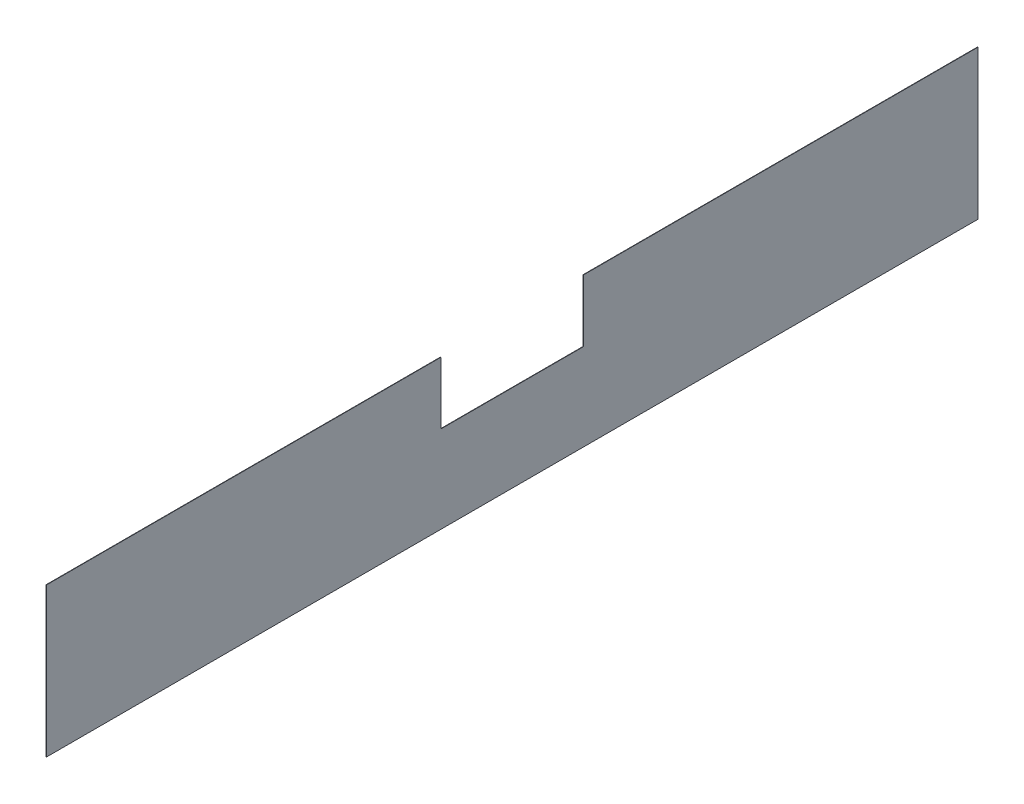
ISO-10303-21;
HEADER;
FILE_DESCRIPTION(('STEP AP214'),'2;1');
FILE_NAME('part.step','',(''),(''),'','','');
FILE_SCHEMA(('AUTOMOTIVE_DESIGN { 1 0 10303 214 1 1 1 1 }'));
ENDSEC;
DATA;
#1=APPLICATION_CONTEXT('core data for automotive mechanical design processes');
#2=APPLICATION_PROTOCOL_DEFINITION('international standard','automotive_design',2000,#1);
#3=PRODUCT_CONTEXT('',#1,'mechanical');
#4=PRODUCT('Part','Part','',(#3));
#5=PRODUCT_RELATED_PRODUCT_CATEGORY('part','',(#4));
#6=PRODUCT_DEFINITION_FORMATION('','',#4);
#7=PRODUCT_DEFINITION_CONTEXT('part definition',#1,'design');
#8=PRODUCT_DEFINITION('design','',#6,#7);
#9=PRODUCT_DEFINITION_SHAPE('','',#8);
#10=(LENGTH_UNIT() NAMED_UNIT(*) SI_UNIT(.MILLI.,.METRE.));
#11=(NAMED_UNIT(*) PLANE_ANGLE_UNIT() SI_UNIT($,.RADIAN.));
#12=(NAMED_UNIT(*) SI_UNIT($,.STERADIAN.) SOLID_ANGLE_UNIT());
#13=UNCERTAINTY_MEASURE_WITH_UNIT(LENGTH_MEASURE(1.E-05),#10,'distance_accuracy_value','');
#14=(GEOMETRIC_REPRESENTATION_CONTEXT(3) GLOBAL_UNCERTAINTY_ASSIGNED_CONTEXT((#13)) GLOBAL_UNIT_ASSIGNED_CONTEXT((#10,
#11,#12)) REPRESENTATION_CONTEXT('',''));
#15=CARTESIAN_POINT('',(0.,0.,0.));
#16=DIRECTION('',(0.,0.,1.));
#17=DIRECTION('',(1.,0.,0.));
#18=AXIS2_PLACEMENT_3D('',#15,#16,#17);
#19=CARTESIAN_POINT('',(-125.327,60.001,150.));
#20=DIRECTION('',(0.,1.,0.));
#21=DIRECTION('',(0.,0.,1.));
#22=AXIS2_PLACEMENT_3D('',#19,#20,#21);
#23=PLANE('',#22);
#24=DIRECTION('',(-1.,0.,0.));
#25=VECTOR('',#24,1.);
#26=CARTESIAN_POINT('',(-115.327,60.001,23.));
#27=LINE('',#26,#25);
#28=CARTESIAN_POINT('',(-125.2,60.001,23.));
#29=VERTEX_POINT('',#28);
#30=CARTESIAN_POINT('',(-125.327,60.001,23.));
#31=VERTEX_POINT('',#30);
#32=EDGE_CURVE('E110',#29,#31,#27,.T.);
#33=ORIENTED_EDGE('',*,*,#32,.T.);
#34=DIRECTION('',(0.,0.,1.));
#35=VECTOR('',#34,1.);
#36=CARTESIAN_POINT('',(-125.327,60.001,150.));
#37=LINE('',#36,#35);
#38=CARTESIAN_POINT('',(-125.327,60.001,150.));
#39=VERTEX_POINT('',#38);
#40=EDGE_CURVE('E122',#31,#39,#37,.T.);
#41=ORIENTED_EDGE('',*,*,#40,.T.);
#42=DIRECTION('',(1.,0.,0.));
#43=VECTOR('',#42,1.);
#44=CARTESIAN_POINT('',(-125.327,60.001,150.));
#45=LINE('',#44,#43);
#46=CARTESIAN_POINT('',(-125.2,60.001,150.));
#47=VERTEX_POINT('',#46);
#48=EDGE_CURVE('E149',#39,#47,#45,.T.);
#49=ORIENTED_EDGE('',*,*,#48,.T.);
#50=DIRECTION('',(0.,0.,1.));
#51=VECTOR('',#50,1.);
#52=CARTESIAN_POINT('',(-125.2,60.001,150.));
#53=LINE('',#52,#51);
#54=EDGE_CURVE('E124',#29,#47,#53,.T.);
#55=ORIENTED_EDGE('',*,*,#54,.F.);
#56=EDGE_LOOP('',(#33,#41,#49,#55));
#57=FACE_BOUND('',#56,.T.);
#58=ADVANCED_FACE('F43',(#57),#23,.T.);
#59=CARTESIAN_POINT('',(-125.327,-60.,150.));
#60=DIRECTION('',(0.,0.,1.));
#61=DIRECTION('',(0.,-1.,0.));
#62=AXIS2_PLACEMENT_3D('',#59,#60,#61);
#63=PLANE('',#62);
#64=DIRECTION('',(-1.,0.,0.));
#65=VECTOR('',#64,1.);
#66=CARTESIAN_POINT('',(-115.327,12.,150.));
#67=LINE('',#66,#65);
#68=CARTESIAN_POINT('',(-125.2,12.,150.));
#69=VERTEX_POINT('',#68);
#70=CARTESIAN_POINT('',(-125.327,12.,150.));
#71=VERTEX_POINT('',#70);
#72=EDGE_CURVE('E164',#69,#71,#67,.T.);
#73=ORIENTED_EDGE('',*,*,#72,.F.);
#74=DIRECTION('',(0.,-1.,0.));
#75=VECTOR('',#74,1.);
#76=CARTESIAN_POINT('',(-125.2,-60.,150.));
#77=LINE('',#76,#75);
#78=EDGE_CURVE('E141',#47,#69,#77,.T.);
#79=ORIENTED_EDGE('',*,*,#78,.F.);
#80=ORIENTED_EDGE('',*,*,#48,.F.);
#81=DIRECTION('',(0.,-1.,0.));
#82=VECTOR('',#81,1.);
#83=CARTESIAN_POINT('',(-125.327,-60.,150.));
#84=LINE('',#83,#82);
#85=EDGE_CURVE('E132',#39,#71,#84,.T.);
#86=ORIENTED_EDGE('',*,*,#85,.T.);
#87=EDGE_LOOP('',(#73,#79,#80,#86));
#88=FACE_BOUND('',#87,.T.);
#89=ADVANCED_FACE('F45',(#88),#63,.T.);
#90=DIRECTION('',(-1.,0.,0.));
#91=VECTOR('',#90,1.);
#92=CARTESIAN_POINT('',(-115.327,60.001,-23.));
#93=LINE('',#92,#91);
#94=CARTESIAN_POINT('',(-125.2,60.001,-23.));
#95=VERTEX_POINT('',#94);
#96=CARTESIAN_POINT('',(-125.327,60.001,-23.));
#97=VERTEX_POINT('',#96);
#98=EDGE_CURVE('E125',#95,#97,#93,.T.);
#99=ORIENTED_EDGE('',*,*,#98,.F.);
#100=CARTESIAN_POINT('',(-125.2,60.001,-150.));
#101=VERTEX_POINT('',#100);
#102=EDGE_CURVE('E146',#101,#95,#53,.T.);
#103=ORIENTED_EDGE('',*,*,#102,.F.);
#104=DIRECTION('',(1.,0.,0.));
#105=VECTOR('',#104,1.);
#106=CARTESIAN_POINT('',(-125.327,60.001,-150.));
#107=LINE('',#106,#105);
#108=CARTESIAN_POINT('',(-125.327,60.001,-150.));
#109=VERTEX_POINT('',#108);
#110=EDGE_CURVE('E137',#109,#101,#107,.T.);
#111=ORIENTED_EDGE('',*,*,#110,.F.);
#112=EDGE_CURVE('E133',#109,#97,#37,.T.);
#113=ORIENTED_EDGE('',*,*,#112,.T.);
#114=EDGE_LOOP('',(#99,#103,#111,#113));
#115=FACE_BOUND('',#114,.T.);
#116=ADVANCED_FACE('F184',(#115),#23,.T.);
#117=CARTESIAN_POINT('',(-125.327,-60.,-150.));
#118=DIRECTION('',(0.,0.,-1.));
#119=DIRECTION('',(-1.,0.,0.));
#120=AXIS2_PLACEMENT_3D('',#117,#118,#119);
#121=PLANE('',#120);
#122=DIRECTION('',(-1.,0.,0.));
#123=VECTOR('',#122,1.);
#124=CARTESIAN_POINT('',(-115.327,12.,-150.));
#125=LINE('',#124,#123);
#126=CARTESIAN_POINT('',(-125.2,12.,-150.));
#127=VERTEX_POINT('',#126);
#128=CARTESIAN_POINT('',(-125.327,12.,-150.));
#129=VERTEX_POINT('',#128);
#130=EDGE_CURVE('E66',#127,#129,#125,.T.);
#131=ORIENTED_EDGE('',*,*,#130,.T.);
#132=DIRECTION('',(0.,1.,0.));
#133=VECTOR('',#132,1.);
#134=CARTESIAN_POINT('',(-125.327,-60.,-150.));
#135=LINE('',#134,#133);
#136=EDGE_CURVE('E134',#129,#109,#135,.T.);
#137=ORIENTED_EDGE('',*,*,#136,.T.);
#138=ORIENTED_EDGE('',*,*,#110,.T.);
#139=DIRECTION('',(0.,1.,0.));
#140=VECTOR('',#139,1.);
#141=CARTESIAN_POINT('',(-125.2,-60.,-150.));
#142=LINE('',#141,#140);
#143=EDGE_CURVE('E144',#127,#101,#142,.T.);
#144=ORIENTED_EDGE('',*,*,#143,.F.);
#145=EDGE_LOOP('',(#131,#137,#138,#144));
#146=FACE_BOUND('',#145,.T.);
#147=ADVANCED_FACE('F177',(#146),#121,.T.);
#148=CARTESIAN_POINT('',(-125.327,0.,0.));
#149=DIRECTION('',(-1.,0.,0.));
#150=DIRECTION('',(0.,0.,1.));
#151=AXIS2_PLACEMENT_3D('',#148,#149,#150);
#152=PLANE('',#151);
#153=DIRECTION('',(0.,1.,0.));
#154=VECTOR('',#153,1.);
#155=CARTESIAN_POINT('',(-125.327,40.001,23.));
#156=LINE('',#155,#154);
#157=CARTESIAN_POINT('',(-125.327,40.001,23.));
#158=VERTEX_POINT('',#157);
#159=EDGE_CURVE('E107',#158,#31,#156,.T.);
#160=ORIENTED_EDGE('',*,*,#159,.F.);
#161=DIRECTION('',(0.,0.,1.));
#162=VECTOR('',#161,1.);
#163=CARTESIAN_POINT('',(-125.327,40.001,-23.));
#164=LINE('',#163,#162);
#165=CARTESIAN_POINT('',(-125.327,40.001,-23.));
#166=VERTEX_POINT('',#165);
#167=EDGE_CURVE('E126',#166,#158,#164,.T.);
#168=ORIENTED_EDGE('',*,*,#167,.F.);
#169=DIRECTION('',(0.,-1.,0.));
#170=VECTOR('',#169,1.);
#171=CARTESIAN_POINT('',(-125.327,40.001,-23.));
#172=LINE('',#171,#170);
#173=EDGE_CURVE('E117',#97,#166,#172,.T.);
#174=ORIENTED_EDGE('',*,*,#173,.F.);
#175=ORIENTED_EDGE('',*,*,#112,.F.);
#176=ORIENTED_EDGE('',*,*,#136,.F.);
#177=DIRECTION('',(0.,0.,-1.));
#178=VECTOR('',#177,1.);
#179=CARTESIAN_POINT('',(-125.327,12.,-150.));
#180=LINE('',#179,#178);
#181=EDGE_CURVE('E162',#71,#129,#180,.T.);
#182=ORIENTED_EDGE('',*,*,#181,.F.);
#183=ORIENTED_EDGE('',*,*,#85,.F.);
#184=ORIENTED_EDGE('',*,*,#40,.F.);
#185=EDGE_LOOP('',(#160,#168,#174,#175,#176,#182,#183,#184));
#186=FACE_BOUND('',#185,.T.);
#187=ADVANCED_FACE('F129',(#186),#152,.T.);
#188=CARTESIAN_POINT('',(-125.2,0.,0.));
#189=DIRECTION('',(-1.,0.,0.));
#190=DIRECTION('',(0.,0.,1.));
#191=AXIS2_PLACEMENT_3D('',#188,#189,#190);
#192=PLANE('',#191);
#193=DIRECTION('',(0.,0.,1.));
#194=VECTOR('',#193,1.);
#195=CARTESIAN_POINT('',(-125.2,40.001,0.));
#196=LINE('',#195,#194);
#197=CARTESIAN_POINT('',(-125.2,40.001,-23.));
#198=VERTEX_POINT('',#197);
#199=CARTESIAN_POINT('',(-125.2,40.001,23.));
#200=VERTEX_POINT('',#199);
#201=EDGE_CURVE('E51',#198,#200,#196,.T.);
#202=ORIENTED_EDGE('',*,*,#201,.T.);
#203=DIRECTION('',(0.,1.,0.));
#204=VECTOR('',#203,1.);
#205=CARTESIAN_POINT('',(-125.2,0.,23.));
#206=LINE('',#205,#204);
#207=EDGE_CURVE('E11',#200,#29,#206,.T.);
#208=ORIENTED_EDGE('',*,*,#207,.T.);
#209=ORIENTED_EDGE('',*,*,#54,.T.);
#210=ORIENTED_EDGE('',*,*,#78,.T.);
#211=DIRECTION('',(0.,0.,-1.));
#212=VECTOR('',#211,1.);
#213=CARTESIAN_POINT('',(-125.2,12.,0.));
#214=LINE('',#213,#212);
#215=EDGE_CURVE('E151',#69,#127,#214,.T.);
#216=ORIENTED_EDGE('',*,*,#215,.T.);
#217=ORIENTED_EDGE('',*,*,#143,.T.);
#218=ORIENTED_EDGE('',*,*,#102,.T.);
#219=DIRECTION('',(0.,-1.,0.));
#220=VECTOR('',#219,1.);
#221=CARTESIAN_POINT('',(-125.2,0.,-23.));
#222=LINE('',#221,#220);
#223=EDGE_CURVE('E155',#95,#198,#222,.T.);
#224=ORIENTED_EDGE('',*,*,#223,.T.);
#225=EDGE_LOOP('',(#202,#208,#209,#210,#216,#217,#218,#224));
#226=FACE_BOUND('',#225,.T.);
#227=ADVANCED_FACE('F159',(#226),#192,.F.);
#228=CARTESIAN_POINT('',(-115.327,12.,-150.));
#229=DIRECTION('',(0.,1.,0.));
#230=DIRECTION('',(0.,0.,1.));
#231=AXIS2_PLACEMENT_3D('',#228,#229,#230);
#232=PLANE('',#231);
#233=ORIENTED_EDGE('',*,*,#72,.T.);
#234=ORIENTED_EDGE('',*,*,#181,.T.);
#235=ORIENTED_EDGE('',*,*,#130,.F.);
#236=ORIENTED_EDGE('',*,*,#215,.F.);
#237=EDGE_LOOP('',(#233,#234,#235,#236));
#238=FACE_BOUND('',#237,.T.);
#239=ADVANCED_FACE('F187',(#238),#232,.F.);
#240=CARTESIAN_POINT('',(-115.327,40.001,23.));
#241=DIRECTION('',(0.,0.,1.));
#242=DIRECTION('',(1.,0.,0.));
#243=AXIS2_PLACEMENT_3D('',#240,#241,#242);
#244=PLANE('',#243);
#245=DIRECTION('',(-1.,0.,0.));
#246=VECTOR('',#245,1.);
#247=CARTESIAN_POINT('',(-115.327,40.001,23.));
#248=LINE('',#247,#246);
#249=EDGE_CURVE('E112',#200,#158,#248,.T.);
#250=ORIENTED_EDGE('',*,*,#249,.T.);
#251=ORIENTED_EDGE('',*,*,#159,.T.);
#252=ORIENTED_EDGE('',*,*,#32,.F.);
#253=ORIENTED_EDGE('',*,*,#207,.F.);
#254=EDGE_LOOP('',(#250,#251,#252,#253));
#255=FACE_BOUND('',#254,.T.);
#256=ADVANCED_FACE('F109',(#255),#244,.F.);
#257=CARTESIAN_POINT('',(-115.327,40.001,-23.));
#258=DIRECTION('',(0.,-1.,0.));
#259=DIRECTION('',(0.,0.,-1.));
#260=AXIS2_PLACEMENT_3D('',#257,#258,#259);
#261=PLANE('',#260);
#262=DIRECTION('',(-1.,0.,0.));
#263=VECTOR('',#262,1.);
#264=CARTESIAN_POINT('',(-115.327,40.001,-23.));
#265=LINE('',#264,#263);
#266=EDGE_CURVE('E58',#198,#166,#265,.T.);
#267=ORIENTED_EDGE('',*,*,#266,.T.);
#268=ORIENTED_EDGE('',*,*,#167,.T.);
#269=ORIENTED_EDGE('',*,*,#249,.F.);
#270=ORIENTED_EDGE('',*,*,#201,.F.);
#271=EDGE_LOOP('',(#267,#268,#269,#270));
#272=FACE_BOUND('',#271,.T.);
#273=ADVANCED_FACE('F161',(#272),#261,.F.);
#274=CARTESIAN_POINT('',(-115.327,40.001,-23.));
#275=DIRECTION('',(0.,0.,-1.));
#276=DIRECTION('',(-1.,0.,0.));
#277=AXIS2_PLACEMENT_3D('',#274,#275,#276);
#278=PLANE('',#277);
#279=ORIENTED_EDGE('',*,*,#98,.T.);
#280=ORIENTED_EDGE('',*,*,#173,.T.);
#281=ORIENTED_EDGE('',*,*,#266,.F.);
#282=ORIENTED_EDGE('',*,*,#223,.F.);
#283=EDGE_LOOP('',(#279,#280,#281,#282));
#284=FACE_BOUND('',#283,.T.);
#285=ADVANCED_FACE('F186',(#284),#278,.F.);
#286=CLOSED_SHELL('',(#58,#89,#116,#147,#187,#227,#239,#256,#273,#285));
#287=MANIFOLD_SOLID_BREP('B2',#286);
#288=ADVANCED_BREP_SHAPE_REPRESENTATION('',(#18,#287),#14);
#289=SHAPE_DEFINITION_REPRESENTATION(#9,#288);
ENDSEC;
END-ISO-10303-21;
